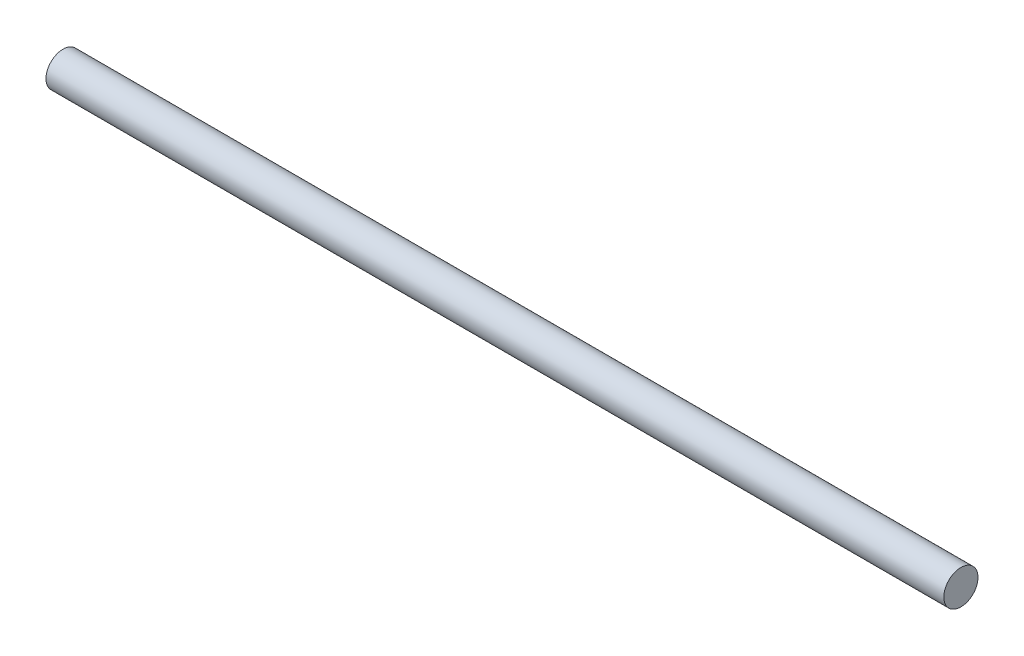
ISO-10303-21;
HEADER;
FILE_DESCRIPTION(('STEP AP214'),'2;1');
FILE_NAME('part.step','',(''),(''),'','','');
FILE_SCHEMA(('AUTOMOTIVE_DESIGN { 1 0 10303 214 1 1 1 1 }'));
ENDSEC;
DATA;
#1=APPLICATION_CONTEXT('core data for automotive mechanical design processes');
#2=APPLICATION_PROTOCOL_DEFINITION('international standard','automotive_design',2000,#1);
#3=PRODUCT_CONTEXT('',#1,'mechanical');
#4=PRODUCT('Part','Part','',(#3));
#5=PRODUCT_RELATED_PRODUCT_CATEGORY('part','',(#4));
#6=PRODUCT_DEFINITION_FORMATION('','',#4);
#7=PRODUCT_DEFINITION_CONTEXT('part definition',#1,'design');
#8=PRODUCT_DEFINITION('design','',#6,#7);
#9=PRODUCT_DEFINITION_SHAPE('','',#8);
#10=(LENGTH_UNIT() NAMED_UNIT(*) SI_UNIT(.MILLI.,.METRE.));
#11=(NAMED_UNIT(*) PLANE_ANGLE_UNIT() SI_UNIT($,.RADIAN.));
#12=(NAMED_UNIT(*) SI_UNIT($,.STERADIAN.) SOLID_ANGLE_UNIT());
#13=UNCERTAINTY_MEASURE_WITH_UNIT(LENGTH_MEASURE(1.E-05),#10,'distance_accuracy_value','');
#14=(GEOMETRIC_REPRESENTATION_CONTEXT(3) GLOBAL_UNCERTAINTY_ASSIGNED_CONTEXT((#13)) GLOBAL_UNIT_ASSIGNED_CONTEXT((#10,
#11,#12)) REPRESENTATION_CONTEXT('',''));
#15=CARTESIAN_POINT('',(0.,0.,0.));
#16=DIRECTION('',(0.,0.,1.));
#17=DIRECTION('',(1.,0.,0.));
#18=AXIS2_PLACEMENT_3D('',#15,#16,#17);
#19=CARTESIAN_POINT('',(210.,16.6527294583716,8.75496674285614));
#20=DIRECTION('',(-1.,0.,0.));
#21=DIRECTION('',(0.,0.,1.));
#22=AXIS2_PLACEMENT_3D('',#19,#20,#21);
#23=CYLINDRICAL_SURFACE('',#22,4.);
#24=CARTESIAN_POINT('',(210.,16.6527294583716,8.75496674285614));
#25=DIRECTION('',(1.,0.,0.));
#26=DIRECTION('',(0.,0.,-1.));
#27=AXIS2_PLACEMENT_3D('',#24,#25,#26);
#28=CIRCLE('',#27,4.);
#29=CARTESIAN_POINT('',(210.,16.6527294583716,4.75496674285614));
#30=VERTEX_POINT('',#29);
#31=EDGE_CURVE('E10',#30,#30,#28,.T.);
#32=ORIENTED_EDGE('',*,*,#31,.F.);
#33=EDGE_LOOP('',(#32));
#34=FACE_BOUND('',#33,.T.);
#35=CARTESIAN_POINT('',(0.,16.6527294583716,8.75496674285614));
#36=DIRECTION('',(1.,0.,0.));
#37=DIRECTION('',(0.,0.,-1.));
#38=AXIS2_PLACEMENT_3D('',#35,#36,#37);
#39=CIRCLE('',#38,4.);
#40=CARTESIAN_POINT('',(0.,16.6527294583716,4.75496674285614));
#41=VERTEX_POINT('',#40);
#42=EDGE_CURVE('E40',#41,#41,#39,.T.);
#43=ORIENTED_EDGE('',*,*,#42,.T.);
#44=EDGE_LOOP('',(#43));
#45=FACE_BOUND('',#44,.T.);
#46=ADVANCED_FACE('F37',(#34,#45),#23,.T.);
#47=CARTESIAN_POINT('',(210.,16.6527294583716,8.75496674285614));
#48=DIRECTION('',(1.,0.,0.));
#49=DIRECTION('',(0.,0.,-1.));
#50=AXIS2_PLACEMENT_3D('',#47,#48,#49);
#51=PLANE('',#50);
#52=ORIENTED_EDGE('',*,*,#31,.T.);
#53=EDGE_LOOP('',(#52));
#54=FACE_BOUND('',#53,.T.);
#55=ADVANCED_FACE('F54',(#54),#51,.T.);
#56=CARTESIAN_POINT('',(0.,16.6527294583716,8.75496674285614));
#57=DIRECTION('',(1.,0.,0.));
#58=DIRECTION('',(0.,0.,-1.));
#59=AXIS2_PLACEMENT_3D('',#56,#57,#58);
#60=PLANE('',#59);
#61=ORIENTED_EDGE('',*,*,#42,.F.);
#62=EDGE_LOOP('',(#61));
#63=FACE_BOUND('',#62,.T.);
#64=ADVANCED_FACE('F52',(#63),#60,.F.);
#65=CLOSED_SHELL('',(#46,#55,#64));
#66=MANIFOLD_SOLID_BREP('B2',#65);
#67=ADVANCED_BREP_SHAPE_REPRESENTATION('',(#18,#66),#14);
#68=SHAPE_DEFINITION_REPRESENTATION(#9,#67);
ENDSEC;
END-ISO-10303-21;
